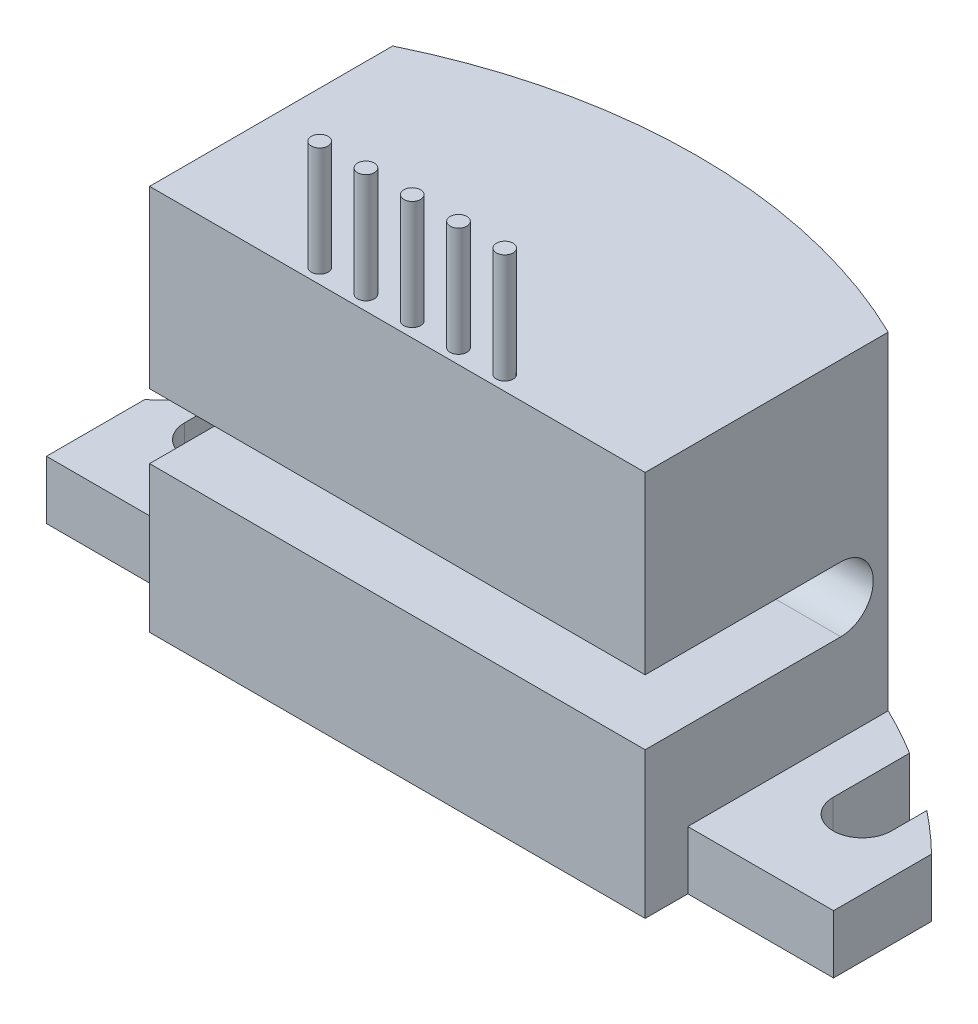
ISO-10303-21;
HEADER;
FILE_DESCRIPTION(('STEP AP214'),'2;1');
FILE_NAME('part.step','',(''),(''),'','','');
FILE_SCHEMA(('AUTOMOTIVE_DESIGN { 1 0 10303 214 1 1 1 1 }'));
ENDSEC;
DATA;
#1=APPLICATION_CONTEXT('core data for automotive mechanical design processes');
#2=APPLICATION_PROTOCOL_DEFINITION('international standard','automotive_design',2000,#1);
#3=PRODUCT_CONTEXT('',#1,'mechanical');
#4=PRODUCT('Part','Part','',(#3));
#5=PRODUCT_RELATED_PRODUCT_CATEGORY('part','',(#4));
#6=PRODUCT_DEFINITION_FORMATION('','',#4);
#7=PRODUCT_DEFINITION_CONTEXT('part definition',#1,'design');
#8=PRODUCT_DEFINITION('design','',#6,#7);
#9=PRODUCT_DEFINITION_SHAPE('','',#8);
#10=(LENGTH_UNIT() NAMED_UNIT(*) SI_UNIT(.MILLI.,.METRE.));
#11=(NAMED_UNIT(*) PLANE_ANGLE_UNIT() SI_UNIT($,.RADIAN.));
#12=(NAMED_UNIT(*) SI_UNIT($,.STERADIAN.) SOLID_ANGLE_UNIT());
#13=UNCERTAINTY_MEASURE_WITH_UNIT(LENGTH_MEASURE(1.E-05),#10,'distance_accuracy_value','');
#14=(GEOMETRIC_REPRESENTATION_CONTEXT(3) GLOBAL_UNCERTAINTY_ASSIGNED_CONTEXT((#13)) GLOBAL_UNIT_ASSIGNED_CONTEXT((#10,
#11,#12)) REPRESENTATION_CONTEXT('',''));
#15=CARTESIAN_POINT('',(0.,0.,0.));
#16=DIRECTION('',(0.,0.,1.));
#17=DIRECTION('',(1.,0.,0.));
#18=AXIS2_PLACEMENT_3D('',#15,#16,#17);
#19=CARTESIAN_POINT('',(-6.8,14.4,-7.25800341788039));
#20=DIRECTION('',(0.,0.,-1.));
#21=DIRECTION('',(-1.,0.,0.));
#22=AXIS2_PLACEMENT_3D('',#19,#20,#21);
#23=PLANE('',#22);
#24=DIRECTION('',(1.,0.,0.));
#25=VECTOR('',#24,1.);
#26=CARTESIAN_POINT('',(-6.8,11.4,-7.25800341788039));
#27=LINE('',#26,#25);
#28=CARTESIAN_POINT('',(-6.8,11.4,-7.25800341788039));
#29=VERTEX_POINT('',#28);
#30=CARTESIAN_POINT('',(6.8,11.4,-7.25800341788039));
#31=VERTEX_POINT('',#30);
#32=EDGE_CURVE('E59',#29,#31,#27,.T.);
#33=ORIENTED_EDGE('',*,*,#32,.F.);
#34=DIRECTION('',(0.,-1.,0.));
#35=VECTOR('',#34,1.);
#36=CARTESIAN_POINT('',(-6.8,14.4,-7.25800341788039));
#37=LINE('',#36,#35);
#38=CARTESIAN_POINT('',(-6.8,6.59,-7.25800341788039));
#39=VERTEX_POINT('',#38);
#40=EDGE_CURVE('E274',#29,#39,#37,.T.);
#41=ORIENTED_EDGE('',*,*,#40,.T.);
#42=DIRECTION('',(-1.,0.,0.));
#43=VECTOR('',#42,1.);
#44=CARTESIAN_POINT('',(10.8,6.59,-7.25800341788035));
#45=LINE('',#44,#43);
#46=CARTESIAN_POINT('',(6.8,6.59,-7.25800341788036));
#47=VERTEX_POINT('',#46);
#48=EDGE_CURVE('E315',#47,#39,#45,.T.);
#49=ORIENTED_EDGE('',*,*,#48,.F.);
#50=DIRECTION('',(0.,-1.,0.));
#51=VECTOR('',#50,1.);
#52=CARTESIAN_POINT('',(6.8,14.4,-7.25800341788039));
#53=LINE('',#52,#51);
#54=EDGE_CURVE('E271',#31,#47,#53,.T.);
#55=ORIENTED_EDGE('',*,*,#54,.F.);
#56=EDGE_LOOP('',(#33,#41,#49,#55));
#57=FACE_BOUND('',#56,.T.);
#58=ADVANCED_FACE('F45',(#57),#23,.F.);
#59=CARTESIAN_POINT('',(0.,14.4,0.));
#60=DIRECTION('',(0.,-1.,0.));
#61=DIRECTION('',(0.,0.,-1.));
#62=AXIS2_PLACEMENT_3D('',#59,#60,#61);
#63=CYLINDRICAL_SURFACE('',#62,15.5);
#64=CARTESIAN_POINT('',(0.,11.4,0.));
#65=DIRECTION('',(0.,1.,0.));
#66=DIRECTION('',(0.,0.,1.));
#67=AXIS2_PLACEMENT_3D('',#64,#65,#66);
#68=CIRCLE('',#67,15.5);
#69=CARTESIAN_POINT('',(6.8,11.4,-13.9287472516375));
#70=VERTEX_POINT('',#69);
#71=CARTESIAN_POINT('',(-6.8,11.4,-13.9287472516375));
#72=VERTEX_POINT('',#71);
#73=EDGE_CURVE('E192',#70,#72,#68,.T.);
#74=ORIENTED_EDGE('',*,*,#73,.F.);
#75=DIRECTION('',(0.,1.,0.));
#76=VECTOR('',#75,1.);
#77=CARTESIAN_POINT('',(6.8,2.4,-13.9287472516375));
#78=LINE('',#77,#76);
#79=CARTESIAN_POINT('',(6.8,2.4,-13.9287472516375));
#80=VERTEX_POINT('',#79);
#81=EDGE_CURVE('E202',#80,#70,#78,.T.);
#82=ORIENTED_EDGE('',*,*,#81,.F.);
#83=CARTESIAN_POINT('',(0.,2.4,0.));
#84=DIRECTION('',(0.,-1.,0.));
#85=DIRECTION('',(0.,0.,-1.));
#86=AXIS2_PLACEMENT_3D('',#83,#84,#85);
#87=CIRCLE('',#86,15.5);
#88=CARTESIAN_POINT('',(8.1,2.4,-13.2151428293454));
#89=VERTEX_POINT('',#88);
#90=EDGE_CURVE('E219',#80,#89,#87,.T.);
#91=ORIENTED_EDGE('',*,*,#90,.T.);
#92=DIRECTION('',(0.,-1.,0.));
#93=VECTOR('',#92,1.);
#94=CARTESIAN_POINT('',(8.1,14.4,-13.2151428293454));
#95=LINE('',#94,#93);
#96=CARTESIAN_POINT('',(8.1,0.8,-13.2151428293454));
#97=VERTEX_POINT('',#96);
#98=EDGE_CURVE('E342',#89,#97,#95,.T.);
#99=ORIENTED_EDGE('',*,*,#98,.T.);
#100=CARTESIAN_POINT('',(0.,0.8,0.));
#101=DIRECTION('',(0.,-1.,0.));
#102=DIRECTION('',(0.,0.,-1.));
#103=AXIS2_PLACEMENT_3D('',#100,#101,#102);
#104=CIRCLE('',#103,15.5);
#105=CARTESIAN_POINT('',(-8.1,0.8,-13.2151428293454));
#106=VERTEX_POINT('',#105);
#107=EDGE_CURVE('E263',#106,#97,#104,.T.);
#108=ORIENTED_EDGE('',*,*,#107,.F.);
#109=DIRECTION('',(0.,-1.,0.));
#110=VECTOR('',#109,1.);
#111=CARTESIAN_POINT('',(-8.1,14.4,-13.2151428293454));
#112=LINE('',#111,#110);
#113=CARTESIAN_POINT('',(-8.1,2.4,-13.2151428293454));
#114=VERTEX_POINT('',#113);
#115=EDGE_CURVE('E355',#114,#106,#112,.T.);
#116=ORIENTED_EDGE('',*,*,#115,.F.);
#117=CARTESIAN_POINT('',(0.,2.4,0.));
#118=DIRECTION('',(0.,1.,0.));
#119=DIRECTION('',(0.,0.,1.));
#120=AXIS2_PLACEMENT_3D('',#117,#118,#119);
#121=CIRCLE('',#120,15.5);
#122=CARTESIAN_POINT('',(-6.8,2.4,-13.9287472516375));
#123=VERTEX_POINT('',#122);
#124=EDGE_CURVE('E225',#123,#114,#121,.T.);
#125=ORIENTED_EDGE('',*,*,#124,.F.);
#126=DIRECTION('',(0.,1.,0.));
#127=VECTOR('',#126,1.);
#128=CARTESIAN_POINT('',(-6.8,2.4,-13.9287472516375));
#129=LINE('',#128,#127);
#130=EDGE_CURVE('E204',#123,#72,#129,.T.);
#131=ORIENTED_EDGE('',*,*,#130,.T.);
#132=EDGE_LOOP('',(#74,#82,#91,#99,#108,#116,#125,#131));
#133=FACE_BOUND('',#132,.T.);
#134=ADVANCED_FACE('F200',(#133),#63,.T.);
#135=CARTESIAN_POINT('',(-6.8,14.4,-8.42800341788039));
#136=DIRECTION('',(1.,0.,0.));
#137=DIRECTION('',(0.,0.,-1.));
#138=AXIS2_PLACEMENT_3D('',#135,#136,#137);
#139=PLANE('',#138);
#140=DIRECTION('',(0.,0.,1.));
#141=VECTOR('',#140,1.);
#142=CARTESIAN_POINT('',(-6.8,11.4,-8.42800341788039));
#143=LINE('',#142,#141);
#144=EDGE_CURVE('E709',#72,#29,#143,.T.);
#145=ORIENTED_EDGE('',*,*,#144,.F.);
#146=ORIENTED_EDGE('',*,*,#130,.F.);
#147=DIRECTION('',(0.,0.,-1.));
#148=VECTOR('',#147,1.);
#149=CARTESIAN_POINT('',(-6.8,2.4,-8.42800341788039));
#150=LINE('',#149,#148);
#151=CARTESIAN_POINT('',(-6.8,2.4,-8.42800341788039));
#152=VERTEX_POINT('',#151);
#153=EDGE_CURVE('E213',#152,#123,#150,.T.);
#154=ORIENTED_EDGE('',*,*,#153,.F.);
#155=DIRECTION('',(0.,-1.,0.));
#156=VECTOR('',#155,1.);
#157=CARTESIAN_POINT('',(-6.8,14.4,-8.42800341788039));
#158=LINE('',#157,#156);
#159=CARTESIAN_POINT('',(-6.8,0.8,-8.42800341788039));
#160=VERTEX_POINT('',#159);
#161=EDGE_CURVE('E276',#152,#160,#158,.T.);
#162=ORIENTED_EDGE('',*,*,#161,.T.);
#163=DIRECTION('',(0.,0.,-1.));
#164=VECTOR('',#163,1.);
#165=CARTESIAN_POINT('',(-6.8,0.8,-8.42800341788039));
#166=LINE('',#165,#164);
#167=CARTESIAN_POINT('',(-6.8,0.8,-7.25800341788039));
#168=VERTEX_POINT('',#167);
#169=EDGE_CURVE('E249',#168,#160,#166,.T.);
#170=ORIENTED_EDGE('',*,*,#169,.F.);
#171=CARTESIAN_POINT('',(-6.8,4.81,-7.25800341788039));
#172=VERTEX_POINT('',#171);
#173=EDGE_CURVE('E273',#172,#168,#37,.T.);
#174=ORIENTED_EDGE('',*,*,#173,.F.);
#175=DIRECTION('',(0.,0.,1.));
#176=VECTOR('',#175,1.);
#177=CARTESIAN_POINT('',(-6.8,4.81,-7.25800341788039));
#178=LINE('',#177,#176);
#179=CARTESIAN_POINT('',(-6.79999999999999,4.81,-12.6280034178804));
#180=VERTEX_POINT('',#179);
#181=EDGE_CURVE('E714',#180,#172,#178,.T.);
#182=ORIENTED_EDGE('',*,*,#181,.F.);
#183=CARTESIAN_POINT('',(-6.79999999999999,5.7,-12.6280034178804));
#184=DIRECTION('',(-1.,0.,0.));
#185=DIRECTION('',(0.,0.,1.));
#186=AXIS2_PLACEMENT_3D('',#183,#184,#185);
#187=CIRCLE('',#186,0.89);
#188=CARTESIAN_POINT('',(-6.79999999999999,6.59,-12.6280034178804));
#189=VERTEX_POINT('',#188);
#190=EDGE_CURVE('E711',#189,#180,#187,.T.);
#191=ORIENTED_EDGE('',*,*,#190,.F.);
#192=DIRECTION('',(0.,0.,-1.));
#193=VECTOR('',#192,1.);
#194=CARTESIAN_POINT('',(-6.79999999999999,6.59,-12.6280034178804));
#195=LINE('',#194,#193);
#196=EDGE_CURVE('E328',#39,#189,#195,.T.);
#197=ORIENTED_EDGE('',*,*,#196,.F.);
#198=ORIENTED_EDGE('',*,*,#40,.F.);
#199=EDGE_LOOP('',(#145,#146,#154,#162,#170,#174,#182,#191,#197,#198));
#200=FACE_BOUND('',#199,.T.);
#201=ADVANCED_FACE('F391',(#200),#139,.F.);
#202=CARTESIAN_POINT('',(6.8,14.4,-7.25800341788039));
#203=DIRECTION('',(-1.,0.,0.));
#204=DIRECTION('',(0.,0.,1.));
#205=AXIS2_PLACEMENT_3D('',#202,#203,#204);
#206=PLANE('',#205);
#207=DIRECTION('',(0.,0.,-1.));
#208=VECTOR('',#207,1.);
#209=CARTESIAN_POINT('',(6.8,11.4,-7.25800341788039));
#210=LINE('',#209,#208);
#211=EDGE_CURVE('E12',#31,#70,#210,.T.);
#212=ORIENTED_EDGE('',*,*,#211,.F.);
#213=ORIENTED_EDGE('',*,*,#54,.T.);
#214=DIRECTION('',(0.,0.,-1.));
#215=VECTOR('',#214,1.);
#216=CARTESIAN_POINT('',(6.8,6.59,-7.25800341788039));
#217=LINE('',#216,#215);
#218=CARTESIAN_POINT('',(6.8,6.59,-12.6280034178804));
#219=VERTEX_POINT('',#218);
#220=EDGE_CURVE('E53',#47,#219,#217,.T.);
#221=ORIENTED_EDGE('',*,*,#220,.T.);
#222=CARTESIAN_POINT('',(6.8,5.7,-12.6280034178804));
#223=DIRECTION('',(-1.,0.,0.));
#224=DIRECTION('',(0.,0.,1.));
#225=AXIS2_PLACEMENT_3D('',#222,#223,#224);
#226=CIRCLE('',#225,0.89);
#227=CARTESIAN_POINT('',(6.8,4.81,-12.6280034178804));
#228=VERTEX_POINT('',#227);
#229=EDGE_CURVE('E305',#219,#228,#226,.T.);
#230=ORIENTED_EDGE('',*,*,#229,.T.);
#231=DIRECTION('',(0.,0.,1.));
#232=VECTOR('',#231,1.);
#233=CARTESIAN_POINT('',(6.8,4.81,-7.25800341788038));
#234=LINE('',#233,#232);
#235=CARTESIAN_POINT('',(6.8,4.81,-7.25800341788039));
#236=VERTEX_POINT('',#235);
#237=EDGE_CURVE('E303',#228,#236,#234,.T.);
#238=ORIENTED_EDGE('',*,*,#237,.T.);
#239=CARTESIAN_POINT('',(6.8,0.8,-7.25800341788039));
#240=VERTEX_POINT('',#239);
#241=EDGE_CURVE('E270',#236,#240,#53,.T.);
#242=ORIENTED_EDGE('',*,*,#241,.T.);
#243=DIRECTION('',(0.,0.,1.));
#244=VECTOR('',#243,1.);
#245=CARTESIAN_POINT('',(6.8,0.8,-7.25800341788039));
#246=LINE('',#245,#244);
#247=CARTESIAN_POINT('',(6.8,0.8,-8.42800341788039));
#248=VERTEX_POINT('',#247);
#249=EDGE_CURVE('E243',#248,#240,#246,.T.);
#250=ORIENTED_EDGE('',*,*,#249,.F.);
#251=DIRECTION('',(0.,-1.,0.));
#252=VECTOR('',#251,1.);
#253=CARTESIAN_POINT('',(6.8,14.4,-8.42800341788039));
#254=LINE('',#253,#252);
#255=CARTESIAN_POINT('',(6.8,2.4,-8.42800341788039));
#256=VERTEX_POINT('',#255);
#257=EDGE_CURVE('E268',#256,#248,#254,.T.);
#258=ORIENTED_EDGE('',*,*,#257,.F.);
#259=DIRECTION('',(0.,0.,1.));
#260=VECTOR('',#259,1.);
#261=CARTESIAN_POINT('',(6.8,2.4,-8.42800341788039));
#262=LINE('',#261,#260);
#263=EDGE_CURVE('E210',#80,#256,#262,.T.);
#264=ORIENTED_EDGE('',*,*,#263,.F.);
#265=ORIENTED_EDGE('',*,*,#81,.T.);
#266=EDGE_LOOP('',(#212,#213,#221,#230,#238,#242,#250,#258,#264,#265));
#267=FACE_BOUND('',#266,.T.);
#268=ADVANCED_FACE('F208',(#267),#206,.F.);
#269=CARTESIAN_POINT('',(9.7,0.8,-12.0896650077659));
#270=VERTEX_POINT('',#269);
#271=CARTESIAN_POINT('',(10.8,0.8,-11.1180034178804));
#272=VERTEX_POINT('',#271);
#273=EDGE_CURVE('E258',#270,#272,#104,.T.);
#274=ORIENTED_EDGE('',*,*,#273,.F.);
#275=DIRECTION('',(0.,-1.,0.));
#276=VECTOR('',#275,1.);
#277=CARTESIAN_POINT('',(9.7,14.4,-12.0896650077659));
#278=LINE('',#277,#276);
#279=CARTESIAN_POINT('',(9.7,2.4,-12.0896650077659));
#280=VERTEX_POINT('',#279);
#281=EDGE_CURVE('E360',#270,#280,#278,.F.);
#282=ORIENTED_EDGE('',*,*,#281,.T.);
#283=CARTESIAN_POINT('',(10.8,2.4,-11.1180034178804));
#284=VERTEX_POINT('',#283);
#285=EDGE_CURVE('E222',#280,#284,#87,.T.);
#286=ORIENTED_EDGE('',*,*,#285,.T.);
#287=DIRECTION('',(0.,-1.,0.));
#288=VECTOR('',#287,1.);
#289=CARTESIAN_POINT('',(10.8,14.4,-11.1180034178804));
#290=LINE('',#289,#288);
#291=EDGE_CURVE('E262',#284,#272,#290,.T.);
#292=ORIENTED_EDGE('',*,*,#291,.T.);
#293=EDGE_LOOP('',(#274,#282,#286,#292));
#294=FACE_BOUND('',#293,.T.);
#295=ADVANCED_FACE('F428',(#294),#63,.T.);
#296=CARTESIAN_POINT('',(-10.8,14.4,-11.1180034178804));
#297=DIRECTION('',(1.,0.,0.));
#298=DIRECTION('',(0.,0.,-1.));
#299=AXIS2_PLACEMENT_3D('',#296,#297,#298);
#300=PLANE('',#299);
#301=DIRECTION('',(0.,0.,1.));
#302=VECTOR('',#301,1.);
#303=CARTESIAN_POINT('',(-10.8,2.4,-11.1180034178804));
#304=LINE('',#303,#302);
#305=CARTESIAN_POINT('',(-10.8,2.4,-11.1180034178804));
#306=VERTEX_POINT('',#305);
#307=CARTESIAN_POINT('',(-10.8,2.4,-8.42800341788039));
#308=VERTEX_POINT('',#307);
#309=EDGE_CURVE('E221',#306,#308,#304,.T.);
#310=ORIENTED_EDGE('',*,*,#309,.F.);
#311=DIRECTION('',(0.,-1.,0.));
#312=VECTOR('',#311,1.);
#313=CARTESIAN_POINT('',(-10.8,14.4,-11.1180034178804));
#314=LINE('',#313,#312);
#315=CARTESIAN_POINT('',(-10.8,0.8,-11.1180034178804));
#316=VERTEX_POINT('',#315);
#317=EDGE_CURVE('E280',#306,#316,#314,.T.);
#318=ORIENTED_EDGE('',*,*,#317,.T.);
#319=DIRECTION('',(0.,0.,-1.));
#320=VECTOR('',#319,1.);
#321=CARTESIAN_POINT('',(-10.8,0.8,-11.1180034178804));
#322=LINE('',#321,#320);
#323=CARTESIAN_POINT('',(-10.8,0.8,-8.42800341788039));
#324=VERTEX_POINT('',#323);
#325=EDGE_CURVE('E255',#324,#316,#322,.T.);
#326=ORIENTED_EDGE('',*,*,#325,.F.);
#327=DIRECTION('',(0.,-1.,0.));
#328=VECTOR('',#327,1.);
#329=CARTESIAN_POINT('',(-10.8,14.4,-8.42800341788039));
#330=LINE('',#329,#328);
#331=EDGE_CURVE('E278',#308,#324,#330,.T.);
#332=ORIENTED_EDGE('',*,*,#331,.F.);
#333=EDGE_LOOP('',(#310,#318,#326,#332));
#334=FACE_BOUND('',#333,.T.);
#335=ADVANCED_FACE('F403',(#334),#300,.F.);
#336=CARTESIAN_POINT('',(-10.8,14.4,-8.42800341788039));
#337=DIRECTION('',(0.,0.,-1.));
#338=DIRECTION('',(-1.,0.,0.));
#339=AXIS2_PLACEMENT_3D('',#336,#337,#338);
#340=PLANE('',#339);
#341=DIRECTION('',(1.,0.,0.));
#342=VECTOR('',#341,1.);
#343=CARTESIAN_POINT('',(-13.3426310951634,2.4,-8.42800341788039));
#344=LINE('',#343,#342);
#345=EDGE_CURVE('E211',#308,#152,#344,.T.);
#346=ORIENTED_EDGE('',*,*,#345,.F.);
#347=ORIENTED_EDGE('',*,*,#331,.T.);
#348=DIRECTION('',(-1.,0.,0.));
#349=VECTOR('',#348,1.);
#350=CARTESIAN_POINT('',(-10.8,0.8,-8.42800341788039));
#351=LINE('',#350,#349);
#352=EDGE_CURVE('E252',#160,#324,#351,.T.);
#353=ORIENTED_EDGE('',*,*,#352,.F.);
#354=ORIENTED_EDGE('',*,*,#161,.F.);
#355=EDGE_LOOP('',(#346,#347,#353,#354));
#356=FACE_BOUND('',#355,.T.);
#357=ADVANCED_FACE('F397',(#356),#340,.F.);
#358=CARTESIAN_POINT('',(-9.7,2.4,-12.0896650077659));
#359=VERTEX_POINT('',#358);
#360=EDGE_CURVE('E224',#359,#306,#121,.T.);
#361=ORIENTED_EDGE('',*,*,#360,.F.);
#362=DIRECTION('',(0.,-1.,0.));
#363=VECTOR('',#362,1.);
#364=CARTESIAN_POINT('',(-9.7,14.4,-12.0896650077659));
#365=LINE('',#364,#363);
#366=CARTESIAN_POINT('',(-9.7,0.8,-12.0896650077659));
#367=VERTEX_POINT('',#366);
#368=EDGE_CURVE('E341',#359,#367,#365,.T.);
#369=ORIENTED_EDGE('',*,*,#368,.T.);
#370=EDGE_CURVE('E259',#316,#367,#104,.T.);
#371=ORIENTED_EDGE('',*,*,#370,.F.);
#372=ORIENTED_EDGE('',*,*,#317,.F.);
#373=EDGE_LOOP('',(#361,#369,#371,#372));
#374=FACE_BOUND('',#373,.T.);
#375=ADVANCED_FACE('F47',(#374),#63,.T.);
#376=ORIENTED_EDGE('',*,*,#241,.F.);
#377=DIRECTION('',(-1.,0.,0.));
#378=VECTOR('',#377,1.);
#379=CARTESIAN_POINT('',(10.8,4.81,-7.25800341788035));
#380=LINE('',#379,#378);
#381=EDGE_CURVE('E67',#236,#172,#380,.T.);
#382=ORIENTED_EDGE('',*,*,#381,.T.);
#383=ORIENTED_EDGE('',*,*,#173,.T.);
#384=DIRECTION('',(-1.,0.,0.));
#385=VECTOR('',#384,1.);
#386=CARTESIAN_POINT('',(-6.8,0.8,-7.25800341788039));
#387=LINE('',#386,#385);
#388=EDGE_CURVE('E246',#240,#168,#387,.T.);
#389=ORIENTED_EDGE('',*,*,#388,.F.);
#390=EDGE_LOOP('',(#376,#382,#383,#389));
#391=FACE_BOUND('',#390,.T.);
#392=ADVANCED_FACE('F386',(#391),#23,.F.);
#393=CARTESIAN_POINT('',(6.8,14.4,-8.42800341788039));
#394=DIRECTION('',(0.,0.,-1.));
#395=DIRECTION('',(-1.,0.,0.));
#396=AXIS2_PLACEMENT_3D('',#393,#394,#395);
#397=PLANE('',#396);
#398=DIRECTION('',(0.,-1.,0.));
#399=VECTOR('',#398,1.);
#400=CARTESIAN_POINT('',(10.8,14.4,-8.42800341788039));
#401=LINE('',#400,#399);
#402=CARTESIAN_POINT('',(10.8,2.4,-8.42800341788039));
#403=VERTEX_POINT('',#402);
#404=CARTESIAN_POINT('',(10.8,0.8,-8.42800341788039));
#405=VERTEX_POINT('',#404);
#406=EDGE_CURVE('E266',#403,#405,#401,.T.);
#407=ORIENTED_EDGE('',*,*,#406,.F.);
#408=DIRECTION('',(1.,0.,0.));
#409=VECTOR('',#408,1.);
#410=CARTESIAN_POINT('',(12.641537105285,2.4,-8.42800341788039));
#411=LINE('',#410,#409);
#412=EDGE_CURVE('E215',#256,#403,#411,.T.);
#413=ORIENTED_EDGE('',*,*,#412,.F.);
#414=ORIENTED_EDGE('',*,*,#257,.T.);
#415=DIRECTION('',(-1.,0.,0.));
#416=VECTOR('',#415,1.);
#417=CARTESIAN_POINT('',(6.8,0.8,-8.42800341788039));
#418=LINE('',#417,#416);
#419=EDGE_CURVE('E238',#405,#248,#418,.T.);
#420=ORIENTED_EDGE('',*,*,#419,.F.);
#421=EDGE_LOOP('',(#407,#413,#414,#420));
#422=FACE_BOUND('',#421,.T.);
#423=ADVANCED_FACE('F377',(#422),#397,.F.);
#424=CARTESIAN_POINT('',(10.8,14.4,-8.42800341788039));
#425=DIRECTION('',(-1.,0.,0.));
#426=DIRECTION('',(0.,0.,1.));
#427=AXIS2_PLACEMENT_3D('',#424,#425,#426);
#428=PLANE('',#427);
#429=ORIENTED_EDGE('',*,*,#291,.F.);
#430=DIRECTION('',(0.,0.,1.));
#431=VECTOR('',#430,1.);
#432=CARTESIAN_POINT('',(10.8,2.4,-8.42800341788039));
#433=LINE('',#432,#431);
#434=EDGE_CURVE('E285',#284,#403,#433,.T.);
#435=ORIENTED_EDGE('',*,*,#434,.T.);
#436=ORIENTED_EDGE('',*,*,#406,.T.);
#437=DIRECTION('',(0.,0.,1.));
#438=VECTOR('',#437,1.);
#439=CARTESIAN_POINT('',(10.8,0.8,-8.42800341788039));
#440=LINE('',#439,#438);
#441=EDGE_CURVE('E282',#272,#405,#440,.T.);
#442=ORIENTED_EDGE('',*,*,#441,.F.);
#443=EDGE_LOOP('',(#429,#435,#436,#442));
#444=FACE_BOUND('',#443,.T.);
#445=ADVANCED_FACE('F374',(#444),#428,.F.);
#446=CARTESIAN_POINT('',(0.,0.8,-10.9480034178804));
#447=DIRECTION('',(0.,-1.,0.));
#448=DIRECTION('',(0.,0.,-1.));
#449=AXIS2_PLACEMENT_3D('',#446,#447,#448);
#450=PLANE('',#449);
#451=DIRECTION('',(0.,0.,1.));
#452=VECTOR('',#451,1.);
#453=CARTESIAN_POINT('',(9.7,0.8,-11.1180034178804));
#454=LINE('',#453,#452);
#455=CARTESIAN_POINT('',(9.7,0.8,-11.1180034178804));
#456=VERTEX_POINT('',#455);
#457=EDGE_CURVE('E335',#270,#456,#454,.T.);
#458=ORIENTED_EDGE('',*,*,#457,.F.);
#459=ORIENTED_EDGE('',*,*,#273,.T.);
#460=ORIENTED_EDGE('',*,*,#441,.T.);
#461=ORIENTED_EDGE('',*,*,#419,.T.);
#462=ORIENTED_EDGE('',*,*,#249,.T.);
#463=ORIENTED_EDGE('',*,*,#388,.T.);
#464=ORIENTED_EDGE('',*,*,#169,.T.);
#465=ORIENTED_EDGE('',*,*,#352,.T.);
#466=ORIENTED_EDGE('',*,*,#325,.T.);
#467=ORIENTED_EDGE('',*,*,#370,.T.);
#468=DIRECTION('',(0.,0.,-1.));
#469=VECTOR('',#468,1.);
#470=CARTESIAN_POINT('',(-9.7,0.8,-13.2151428293454));
#471=LINE('',#470,#469);
#472=CARTESIAN_POINT('',(-9.7,0.8,-11.1180034178804));
#473=VERTEX_POINT('',#472);
#474=EDGE_CURVE('E348',#473,#367,#471,.T.);
#475=ORIENTED_EDGE('',*,*,#474,.F.);
#476=CARTESIAN_POINT('',(-8.9,0.8,-11.1180034178804));
#477=DIRECTION('',(0.,-1.,0.));
#478=DIRECTION('',(0.,0.,-1.));
#479=AXIS2_PLACEMENT_3D('',#476,#477,#478);
#480=CIRCLE('',#479,0.8);
#481=CARTESIAN_POINT('',(-8.1,0.8,-11.1180034178804));
#482=VERTEX_POINT('',#481);
#483=EDGE_CURVE('E321',#482,#473,#480,.T.);
#484=ORIENTED_EDGE('',*,*,#483,.F.);
#485=DIRECTION('',(0.,0.,1.));
#486=VECTOR('',#485,1.);
#487=CARTESIAN_POINT('',(-8.1,0.8,-11.1180034178804));
#488=LINE('',#487,#486);
#489=EDGE_CURVE('E350',#106,#482,#488,.T.);
#490=ORIENTED_EDGE('',*,*,#489,.F.);
#491=ORIENTED_EDGE('',*,*,#107,.T.);
#492=DIRECTION('',(0.,0.,-1.));
#493=VECTOR('',#492,1.);
#494=CARTESIAN_POINT('',(8.1,0.8,-11.1180034178804));
#495=LINE('',#494,#493);
#496=CARTESIAN_POINT('',(8.1,0.8,-11.1180034178804));
#497=VERTEX_POINT('',#496);
#498=EDGE_CURVE('E332',#497,#97,#495,.T.);
#499=ORIENTED_EDGE('',*,*,#498,.F.);
#500=CARTESIAN_POINT('',(8.9,0.8,-11.1180034178804));
#501=DIRECTION('',(0.,-1.,0.));
#502=DIRECTION('',(0.,0.,-1.));
#503=AXIS2_PLACEMENT_3D('',#500,#501,#502);
#504=CIRCLE('',#503,0.8);
#505=EDGE_CURVE('E329',#456,#497,#504,.T.);
#506=ORIENTED_EDGE('',*,*,#505,.F.);
#507=EDGE_LOOP('',(#458,#459,#460,#461,#462,#463,#464,#465,#466,#467,#475,#484,#490,#491,#499,#506));
#508=FACE_BOUND('',#507,.T.);
#509=CARTESIAN_POINT('',(6.4,0.8,-10.9480034178804));
#510=DIRECTION('',(0.,-1.,0.));
#511=DIRECTION('',(0.,0.,-1.));
#512=AXIS2_PLACEMENT_3D('',#509,#510,#511);
#513=CIRCLE('',#512,1.);
#514=CARTESIAN_POINT('',(6.4,0.8,-11.9480034178804));
#515=VERTEX_POINT('',#514);
#516=EDGE_CURVE('E235',#515,#515,#513,.T.);
#517=ORIENTED_EDGE('',*,*,#516,.F.);
#518=EDGE_LOOP('',(#517));
#519=FACE_BOUND('',#518,.T.);
#520=CARTESIAN_POINT('',(-6.4,0.8,-10.9480034178804));
#521=DIRECTION('',(0.,-1.,0.));
#522=DIRECTION('',(0.,0.,-1.));
#523=AXIS2_PLACEMENT_3D('',#520,#521,#522);
#524=CIRCLE('',#523,1.);
#525=CARTESIAN_POINT('',(-6.4,0.8,-11.9480034178804));
#526=VERTEX_POINT('',#525);
#527=EDGE_CURVE('E229',#526,#526,#524,.T.);
#528=ORIENTED_EDGE('',*,*,#527,.F.);
#529=EDGE_LOOP('',(#528));
#530=FACE_BOUND('',#529,.T.);
#531=ADVANCED_FACE('F381',(#508,#519,#530),#450,.T.);
#532=CARTESIAN_POINT('',(6.4,0.8,-10.9480034178804));
#533=DIRECTION('',(0.,-1.,0.));
#534=DIRECTION('',(0.,0.,-1.));
#535=AXIS2_PLACEMENT_3D('',#532,#533,#534);
#536=CYLINDRICAL_SURFACE('',#535,1.);
#537=ORIENTED_EDGE('',*,*,#516,.T.);
#538=EDGE_LOOP('',(#537));
#539=FACE_BOUND('',#538,.T.);
#540=CARTESIAN_POINT('',(6.4,0.,-10.9480034178804));
#541=DIRECTION('',(0.,-1.,0.));
#542=DIRECTION('',(0.,0.,-1.));
#543=AXIS2_PLACEMENT_3D('',#540,#541,#542);
#544=CIRCLE('',#543,1.);
#545=CARTESIAN_POINT('',(6.4,0.,-11.9480034178804));
#546=VERTEX_POINT('',#545);
#547=EDGE_CURVE('E232',#546,#546,#544,.T.);
#548=ORIENTED_EDGE('',*,*,#547,.F.);
#549=EDGE_LOOP('',(#548));
#550=FACE_BOUND('',#549,.T.);
#551=ADVANCED_FACE('F490',(#539,#550),#536,.T.);
#552=CARTESIAN_POINT('',(-6.4,0.8,-10.9480034178804));
#553=DIRECTION('',(0.,-1.,0.));
#554=DIRECTION('',(0.,0.,-1.));
#555=AXIS2_PLACEMENT_3D('',#552,#553,#554);
#556=CYLINDRICAL_SURFACE('',#555,1.);
#557=ORIENTED_EDGE('',*,*,#527,.T.);
#558=EDGE_LOOP('',(#557));
#559=FACE_BOUND('',#558,.T.);
#560=CARTESIAN_POINT('',(-6.4,0.,-10.9480034178804));
#561=DIRECTION('',(0.,-1.,0.));
#562=DIRECTION('',(0.,0.,-1.));
#563=AXIS2_PLACEMENT_3D('',#560,#561,#562);
#564=CIRCLE('',#563,1.);
#565=CARTESIAN_POINT('',(-6.4,0.,-11.9480034178804));
#566=VERTEX_POINT('',#565);
#567=EDGE_CURVE('E228',#566,#566,#564,.T.);
#568=ORIENTED_EDGE('',*,*,#567,.F.);
#569=EDGE_LOOP('',(#568));
#570=FACE_BOUND('',#569,.T.);
#571=ADVANCED_FACE('F480',(#559,#570),#556,.T.);
#572=CARTESIAN_POINT('',(0.,0.,0.));
#573=DIRECTION('',(0.,1.,0.));
#574=DIRECTION('',(0.,0.,1.));
#575=AXIS2_PLACEMENT_3D('',#572,#573,#574);
#576=PLANE('',#575);
#577=ORIENTED_EDGE('',*,*,#547,.T.);
#578=EDGE_LOOP('',(#577));
#579=FACE_BOUND('',#578,.T.);
#580=ADVANCED_FACE('F476',(#579),#576,.F.);
#581=ORIENTED_EDGE('',*,*,#567,.T.);
#582=EDGE_LOOP('',(#581));
#583=FACE_BOUND('',#582,.T.);
#584=ADVANCED_FACE('F479',(#583),#576,.F.);
#585=CARTESIAN_POINT('',(0.,2.4,0.));
#586=DIRECTION('',(0.,-1.,0.));
#587=DIRECTION('',(0.,0.,-1.));
#588=AXIS2_PLACEMENT_3D('',#585,#586,#587);
#589=PLANE('',#588);
#590=ORIENTED_EDGE('',*,*,#285,.F.);
#591=DIRECTION('',(0.,0.,1.));
#592=VECTOR('',#591,1.);
#593=CARTESIAN_POINT('',(9.7,2.4,0.));
#594=LINE('',#593,#592);
#595=CARTESIAN_POINT('',(9.7,2.4,-11.1180034178804));
#596=VERTEX_POINT('',#595);
#597=EDGE_CURVE('E300',#280,#596,#594,.T.);
#598=ORIENTED_EDGE('',*,*,#597,.T.);
#599=CARTESIAN_POINT('',(8.9,2.4,-11.1180034178804));
#600=DIRECTION('',(0.,-1.,0.));
#601=DIRECTION('',(0.,0.,-1.));
#602=AXIS2_PLACEMENT_3D('',#599,#600,#601);
#603=CIRCLE('',#602,0.8);
#604=CARTESIAN_POINT('',(8.1,2.4,-11.1180034178804));
#605=VERTEX_POINT('',#604);
#606=EDGE_CURVE('E297',#596,#605,#603,.T.);
#607=ORIENTED_EDGE('',*,*,#606,.T.);
#608=DIRECTION('',(0.,0.,-1.));
#609=VECTOR('',#608,1.);
#610=CARTESIAN_POINT('',(8.1,2.4,0.));
#611=LINE('',#610,#609);
#612=EDGE_CURVE('E294',#605,#89,#611,.T.);
#613=ORIENTED_EDGE('',*,*,#612,.T.);
#614=ORIENTED_EDGE('',*,*,#90,.F.);
#615=ORIENTED_EDGE('',*,*,#263,.T.);
#616=ORIENTED_EDGE('',*,*,#412,.T.);
#617=ORIENTED_EDGE('',*,*,#434,.F.);
#618=EDGE_LOOP('',(#590,#598,#607,#613,#614,#615,#616,#617));
#619=FACE_BOUND('',#618,.T.);
#620=ADVANCED_FACE('F369',(#619),#589,.F.);
#621=CARTESIAN_POINT('',(0.,2.4,0.));
#622=DIRECTION('',(0.,1.,0.));
#623=DIRECTION('',(0.,0.,1.));
#624=AXIS2_PLACEMENT_3D('',#621,#622,#623);
#625=PLANE('',#624);
#626=DIRECTION('',(0.,0.,-1.));
#627=VECTOR('',#626,1.);
#628=CARTESIAN_POINT('',(-8.1,2.4,0.));
#629=LINE('',#628,#627);
#630=CARTESIAN_POINT('',(-8.1,2.4,-11.1180034178804));
#631=VERTEX_POINT('',#630);
#632=EDGE_CURVE('E292',#631,#114,#629,.T.);
#633=ORIENTED_EDGE('',*,*,#632,.F.);
#634=CARTESIAN_POINT('',(-8.9,2.4,-11.1180034178804));
#635=DIRECTION('',(0.,1.,0.));
#636=DIRECTION('',(0.,0.,1.));
#637=AXIS2_PLACEMENT_3D('',#634,#635,#636);
#638=CIRCLE('',#637,0.8);
#639=CARTESIAN_POINT('',(-9.7,2.4,-11.1180034178804));
#640=VERTEX_POINT('',#639);
#641=EDGE_CURVE('E290',#640,#631,#638,.T.);
#642=ORIENTED_EDGE('',*,*,#641,.F.);
#643=DIRECTION('',(0.,0.,1.));
#644=VECTOR('',#643,1.);
#645=CARTESIAN_POINT('',(-9.7,2.4,0.));
#646=LINE('',#645,#644);
#647=EDGE_CURVE('E288',#359,#640,#646,.T.);
#648=ORIENTED_EDGE('',*,*,#647,.F.);
#649=ORIENTED_EDGE('',*,*,#360,.T.);
#650=ORIENTED_EDGE('',*,*,#309,.T.);
#651=ORIENTED_EDGE('',*,*,#345,.T.);
#652=ORIENTED_EDGE('',*,*,#153,.T.);
#653=ORIENTED_EDGE('',*,*,#124,.T.);
#654=EDGE_LOOP('',(#633,#642,#648,#649,#650,#651,#652,#653));
#655=FACE_BOUND('',#654,.T.);
#656=ADVANCED_FACE('F499',(#655),#625,.T.);
#657=CARTESIAN_POINT('',(-9.7,14.4,-13.2151428293454));
#658=DIRECTION('',(-1.,0.,0.));
#659=DIRECTION('',(0.,0.,1.));
#660=AXIS2_PLACEMENT_3D('',#657,#658,#659);
#661=PLANE('',#660);
#662=ORIENTED_EDGE('',*,*,#647,.T.);
#663=DIRECTION('',(0.,-1.,0.));
#664=VECTOR('',#663,1.);
#665=CARTESIAN_POINT('',(-9.7,14.4,-11.1180034178804));
#666=LINE('',#665,#664);
#667=EDGE_CURVE('E353',#640,#473,#666,.T.);
#668=ORIENTED_EDGE('',*,*,#667,.T.);
#669=ORIENTED_EDGE('',*,*,#474,.T.);
#670=ORIENTED_EDGE('',*,*,#368,.F.);
#671=EDGE_LOOP('',(#662,#668,#669,#670));
#672=FACE_BOUND('',#671,.T.);
#673=ADVANCED_FACE('F411',(#672),#661,.F.);
#674=CARTESIAN_POINT('',(-8.9,14.4,-11.1180034178804));
#675=DIRECTION('',(0.,-1.,0.));
#676=DIRECTION('',(0.,0.,-1.));
#677=AXIS2_PLACEMENT_3D('',#674,#675,#676);
#678=CYLINDRICAL_SURFACE('',#677,0.8);
#679=ORIENTED_EDGE('',*,*,#641,.T.);
#680=DIRECTION('',(0.,-1.,0.));
#681=VECTOR('',#680,1.);
#682=CARTESIAN_POINT('',(-8.1,14.4,-11.1180034178804));
#683=LINE('',#682,#681);
#684=EDGE_CURVE('E333',#631,#482,#683,.T.);
#685=ORIENTED_EDGE('',*,*,#684,.T.);
#686=ORIENTED_EDGE('',*,*,#483,.T.);
#687=ORIENTED_EDGE('',*,*,#667,.F.);
#688=EDGE_LOOP('',(#679,#685,#686,#687));
#689=FACE_BOUND('',#688,.T.);
#690=ADVANCED_FACE('F416',(#689),#678,.F.);
#691=CARTESIAN_POINT('',(-8.1,14.4,-11.1180034178804));
#692=DIRECTION('',(1.,0.,0.));
#693=DIRECTION('',(0.,0.,-1.));
#694=AXIS2_PLACEMENT_3D('',#691,#692,#693);
#695=PLANE('',#694);
#696=ORIENTED_EDGE('',*,*,#632,.T.);
#697=ORIENTED_EDGE('',*,*,#115,.T.);
#698=ORIENTED_EDGE('',*,*,#489,.T.);
#699=ORIENTED_EDGE('',*,*,#684,.F.);
#700=EDGE_LOOP('',(#696,#697,#698,#699));
#701=FACE_BOUND('',#700,.T.);
#702=ADVANCED_FACE('F420',(#701),#695,.F.);
#703=CARTESIAN_POINT('',(8.9,14.4,-11.1180034178804));
#704=DIRECTION('',(0.,-1.,0.));
#705=DIRECTION('',(0.,0.,-1.));
#706=AXIS2_PLACEMENT_3D('',#703,#704,#705);
#707=CYLINDRICAL_SURFACE('',#706,0.8);
#708=DIRECTION('',(0.,-1.,0.));
#709=VECTOR('',#708,1.);
#710=CARTESIAN_POINT('',(9.7,14.4,-11.1180034178804));
#711=LINE('',#710,#709);
#712=EDGE_CURVE('E339',#596,#456,#711,.T.);
#713=ORIENTED_EDGE('',*,*,#712,.T.);
#714=ORIENTED_EDGE('',*,*,#505,.T.);
#715=DIRECTION('',(0.,-1.,0.));
#716=VECTOR('',#715,1.);
#717=CARTESIAN_POINT('',(8.1,14.4,-11.1180034178804));
#718=LINE('',#717,#716);
#719=EDGE_CURVE('E338',#605,#497,#718,.T.);
#720=ORIENTED_EDGE('',*,*,#719,.F.);
#721=ORIENTED_EDGE('',*,*,#606,.F.);
#722=EDGE_LOOP('',(#713,#714,#720,#721));
#723=FACE_BOUND('',#722,.T.);
#724=ADVANCED_FACE('F433',(#723),#707,.F.);
#725=CARTESIAN_POINT('',(9.7,14.4,-11.1180034178804));
#726=DIRECTION('',(1.,0.,0.));
#727=DIRECTION('',(0.,0.,-1.));
#728=AXIS2_PLACEMENT_3D('',#725,#726,#727);
#729=PLANE('',#728);
#730=ORIENTED_EDGE('',*,*,#457,.T.);
#731=ORIENTED_EDGE('',*,*,#712,.F.);
#732=ORIENTED_EDGE('',*,*,#597,.F.);
#733=ORIENTED_EDGE('',*,*,#281,.F.);
#734=EDGE_LOOP('',(#730,#731,#732,#733));
#735=FACE_BOUND('',#734,.T.);
#736=ADVANCED_FACE('F431',(#735),#729,.F.);
#737=CARTESIAN_POINT('',(8.1,14.4,-11.1180034178804));
#738=DIRECTION('',(-1.,0.,0.));
#739=DIRECTION('',(0.,0.,1.));
#740=AXIS2_PLACEMENT_3D('',#737,#738,#739);
#741=PLANE('',#740);
#742=ORIENTED_EDGE('',*,*,#719,.T.);
#743=ORIENTED_EDGE('',*,*,#498,.T.);
#744=ORIENTED_EDGE('',*,*,#98,.F.);
#745=ORIENTED_EDGE('',*,*,#612,.F.);
#746=EDGE_LOOP('',(#742,#743,#744,#745));
#747=FACE_BOUND('',#746,.T.);
#748=ADVANCED_FACE('F436',(#747),#741,.F.);
#749=CARTESIAN_POINT('',(10.8,5.7,-12.6280034178803));
#750=DIRECTION('',(-1.,0.,0.));
#751=DIRECTION('',(0.,0.,1.));
#752=AXIS2_PLACEMENT_3D('',#749,#750,#751);
#753=CYLINDRICAL_SURFACE('',#752,0.89);
#754=DIRECTION('',(-1.,0.,0.));
#755=VECTOR('',#754,1.);
#756=CARTESIAN_POINT('',(10.8,6.59,-12.6280034178803));
#757=LINE('',#756,#755);
#758=EDGE_CURVE('E317',#219,#189,#757,.T.);
#759=ORIENTED_EDGE('',*,*,#758,.T.);
#760=ORIENTED_EDGE('',*,*,#190,.T.);
#761=DIRECTION('',(-1.,0.,0.));
#762=VECTOR('',#761,1.);
#763=CARTESIAN_POINT('',(10.8,4.81,-12.6280034178803));
#764=LINE('',#763,#762);
#765=EDGE_CURVE('E323',#228,#180,#764,.T.);
#766=ORIENTED_EDGE('',*,*,#765,.F.);
#767=ORIENTED_EDGE('',*,*,#229,.F.);
#768=EDGE_LOOP('',(#759,#760,#766,#767));
#769=FACE_BOUND('',#768,.T.);
#770=ADVANCED_FACE('F438',(#769),#753,.F.);
#771=CARTESIAN_POINT('',(10.8,6.59,-12.6280034178803));
#772=DIRECTION('',(0.,1.,0.));
#773=DIRECTION('',(0.,0.,1.));
#774=AXIS2_PLACEMENT_3D('',#771,#772,#773);
#775=PLANE('',#774);
#776=ORIENTED_EDGE('',*,*,#48,.T.);
#777=ORIENTED_EDGE('',*,*,#196,.T.);
#778=ORIENTED_EDGE('',*,*,#758,.F.);
#779=ORIENTED_EDGE('',*,*,#220,.F.);
#780=EDGE_LOOP('',(#776,#777,#778,#779));
#781=FACE_BOUND('',#780,.T.);
#782=ADVANCED_FACE('F313',(#781),#775,.F.);
#783=CARTESIAN_POINT('',(10.8,4.81,-7.25800341788035));
#784=DIRECTION('',(0.,-1.,0.));
#785=DIRECTION('',(0.,0.,-1.));
#786=AXIS2_PLACEMENT_3D('',#783,#784,#785);
#787=PLANE('',#786);
#788=ORIENTED_EDGE('',*,*,#765,.T.);
#789=ORIENTED_EDGE('',*,*,#181,.T.);
#790=ORIENTED_EDGE('',*,*,#381,.F.);
#791=ORIENTED_EDGE('',*,*,#237,.F.);
#792=EDGE_LOOP('',(#788,#789,#790,#791));
#793=FACE_BOUND('',#792,.T.);
#794=ADVANCED_FACE('F543',(#793),#787,.F.);
#795=CARTESIAN_POINT('',(0.,11.4,-7.66626964409056));
#796=DIRECTION('',(0.,1.,0.));
#797=DIRECTION('',(0.,0.,1.));
#798=AXIS2_PLACEMENT_3D('',#795,#796,#797);
#799=PLANE('',#798);
#800=CARTESIAN_POINT('',(0.,11.4,-7.66626964409056));
#801=DIRECTION('',(0.,1.,0.));
#802=DIRECTION('',(0.,0.,1.));
#803=AXIS2_PLACEMENT_3D('',#800,#801,#802);
#804=CIRCLE('',#803,0.229999999999999);
#805=CARTESIAN_POINT('',(0.,11.4,-7.43626964409056));
#806=VERTEX_POINT('',#805);
#807=EDGE_CURVE('E205',#806,#806,#804,.T.);
#808=ORIENTED_EDGE('',*,*,#807,.F.);
#809=EDGE_LOOP('',(#808));
#810=FACE_BOUND('',#809,.T.);
#811=CARTESIAN_POINT('',(1.27,11.4,-7.66626964409056));
#812=DIRECTION('',(0.,1.,0.));
#813=DIRECTION('',(0.,0.,1.));
#814=AXIS2_PLACEMENT_3D('',#811,#812,#813);
#815=CIRCLE('',#814,0.23);
#816=CARTESIAN_POINT('',(1.27,11.4,-7.43626964409056));
#817=VERTEX_POINT('',#816);
#818=EDGE_CURVE('E698',#817,#817,#815,.T.);
#819=ORIENTED_EDGE('',*,*,#818,.F.);
#820=EDGE_LOOP('',(#819));
#821=FACE_BOUND('',#820,.T.);
#822=CARTESIAN_POINT('',(2.54,11.4,-7.66626964409056));
#823=DIRECTION('',(0.,1.,0.));
#824=DIRECTION('',(0.,0.,1.));
#825=AXIS2_PLACEMENT_3D('',#822,#823,#824);
#826=CIRCLE('',#825,0.23);
#827=CARTESIAN_POINT('',(2.54,11.4,-7.43626964409056));
#828=VERTEX_POINT('',#827);
#829=EDGE_CURVE('E692',#828,#828,#826,.T.);
#830=ORIENTED_EDGE('',*,*,#829,.F.);
#831=EDGE_LOOP('',(#830));
#832=FACE_BOUND('',#831,.T.);
#833=CARTESIAN_POINT('',(-1.27,11.4,-7.66626964409056));
#834=DIRECTION('',(0.,1.,0.));
#835=DIRECTION('',(0.,0.,1.));
#836=AXIS2_PLACEMENT_3D('',#833,#834,#835);
#837=CIRCLE('',#836,0.23);
#838=CARTESIAN_POINT('',(-1.27,11.4,-7.43626964409056));
#839=VERTEX_POINT('',#838);
#840=EDGE_CURVE('E686',#839,#839,#837,.T.);
#841=ORIENTED_EDGE('',*,*,#840,.F.);
#842=EDGE_LOOP('',(#841));
#843=FACE_BOUND('',#842,.T.);
#844=CARTESIAN_POINT('',(-2.54,11.4,-7.66626964409056));
#845=DIRECTION('',(0.,1.,0.));
#846=DIRECTION('',(0.,0.,1.));
#847=AXIS2_PLACEMENT_3D('',#844,#845,#846);
#848=CIRCLE('',#847,0.23);
#849=CARTESIAN_POINT('',(-2.54,11.4,-7.43626964409056));
#850=VERTEX_POINT('',#849);
#851=EDGE_CURVE('E680',#850,#850,#848,.T.);
#852=ORIENTED_EDGE('',*,*,#851,.F.);
#853=EDGE_LOOP('',(#852));
#854=FACE_BOUND('',#853,.T.);
#855=ORIENTED_EDGE('',*,*,#144,.T.);
#856=ORIENTED_EDGE('',*,*,#32,.T.);
#857=ORIENTED_EDGE('',*,*,#211,.T.);
#858=ORIENTED_EDGE('',*,*,#73,.T.);
#859=EDGE_LOOP('',(#855,#856,#857,#858));
#860=FACE_BOUND('',#859,.T.);
#861=ADVANCED_FACE('F191',(#810,#821,#832,#843,#854,#860),#799,.T.);
#862=CARTESIAN_POINT('',(0.,11.4,-7.66626964409056));
#863=DIRECTION('',(0.,1.,0.));
#864=DIRECTION('',(0.,0.,1.));
#865=AXIS2_PLACEMENT_3D('',#862,#863,#864);
#866=CYLINDRICAL_SURFACE('',#865,0.229999999999999);
#867=ORIENTED_EDGE('',*,*,#807,.T.);
#868=EDGE_LOOP('',(#867));
#869=FACE_BOUND('',#868,.T.);
#870=CARTESIAN_POINT('',(0.,14.4,-7.66626964409056));
#871=DIRECTION('',(0.,1.,0.));
#872=DIRECTION('',(0.,0.,1.));
#873=AXIS2_PLACEMENT_3D('',#870,#871,#872);
#874=CIRCLE('',#873,0.229999999999999);
#875=CARTESIAN_POINT('',(0.,14.4,-7.43626964409056));
#876=VERTEX_POINT('',#875);
#877=EDGE_CURVE('E701',#876,#876,#874,.T.);
#878=ORIENTED_EDGE('',*,*,#877,.F.);
#879=EDGE_LOOP('',(#878));
#880=FACE_BOUND('',#879,.T.);
#881=ADVANCED_FACE('F583',(#869,#880),#866,.T.);
#882=CARTESIAN_POINT('',(1.27,11.4,-7.66626964409056));
#883=DIRECTION('',(0.,1.,0.));
#884=DIRECTION('',(0.,0.,1.));
#885=AXIS2_PLACEMENT_3D('',#882,#883,#884);
#886=CYLINDRICAL_SURFACE('',#885,0.23);
#887=ORIENTED_EDGE('',*,*,#818,.T.);
#888=EDGE_LOOP('',(#887));
#889=FACE_BOUND('',#888,.T.);
#890=CARTESIAN_POINT('',(1.27,14.4,-7.66626964409056));
#891=DIRECTION('',(0.,1.,0.));
#892=DIRECTION('',(0.,0.,1.));
#893=AXIS2_PLACEMENT_3D('',#890,#891,#892);
#894=CIRCLE('',#893,0.23);
#895=CARTESIAN_POINT('',(1.27,14.4,-7.43626964409056));
#896=VERTEX_POINT('',#895);
#897=EDGE_CURVE('E695',#896,#896,#894,.T.);
#898=ORIENTED_EDGE('',*,*,#897,.F.);
#899=EDGE_LOOP('',(#898));
#900=FACE_BOUND('',#899,.T.);
#901=ADVANCED_FACE('F593',(#889,#900),#886,.T.);
#902=CARTESIAN_POINT('',(2.54,11.4,-7.66626964409056));
#903=DIRECTION('',(0.,1.,0.));
#904=DIRECTION('',(0.,0.,1.));
#905=AXIS2_PLACEMENT_3D('',#902,#903,#904);
#906=CYLINDRICAL_SURFACE('',#905,0.23);
#907=ORIENTED_EDGE('',*,*,#829,.T.);
#908=EDGE_LOOP('',(#907));
#909=FACE_BOUND('',#908,.T.);
#910=CARTESIAN_POINT('',(2.54,14.4,-7.66626964409056));
#911=DIRECTION('',(0.,1.,0.));
#912=DIRECTION('',(0.,0.,1.));
#913=AXIS2_PLACEMENT_3D('',#910,#911,#912);
#914=CIRCLE('',#913,0.23);
#915=CARTESIAN_POINT('',(2.54,14.4,-7.43626964409056));
#916=VERTEX_POINT('',#915);
#917=EDGE_CURVE('E689',#916,#916,#914,.T.);
#918=ORIENTED_EDGE('',*,*,#917,.F.);
#919=EDGE_LOOP('',(#918));
#920=FACE_BOUND('',#919,.T.);
#921=ADVANCED_FACE('F603',(#909,#920),#906,.T.);
#922=CARTESIAN_POINT('',(-1.27,11.4,-7.66626964409056));
#923=DIRECTION('',(0.,1.,0.));
#924=DIRECTION('',(0.,0.,1.));
#925=AXIS2_PLACEMENT_3D('',#922,#923,#924);
#926=CYLINDRICAL_SURFACE('',#925,0.23);
#927=ORIENTED_EDGE('',*,*,#840,.T.);
#928=EDGE_LOOP('',(#927));
#929=FACE_BOUND('',#928,.T.);
#930=CARTESIAN_POINT('',(-1.27,14.4,-7.66626964409056));
#931=DIRECTION('',(0.,1.,0.));
#932=DIRECTION('',(0.,0.,1.));
#933=AXIS2_PLACEMENT_3D('',#930,#931,#932);
#934=CIRCLE('',#933,0.23);
#935=CARTESIAN_POINT('',(-1.27,14.4,-7.43626964409056));
#936=VERTEX_POINT('',#935);
#937=EDGE_CURVE('E683',#936,#936,#934,.T.);
#938=ORIENTED_EDGE('',*,*,#937,.F.);
#939=EDGE_LOOP('',(#938));
#940=FACE_BOUND('',#939,.T.);
#941=ADVANCED_FACE('F613',(#929,#940),#926,.T.);
#942=CARTESIAN_POINT('',(-2.54,11.4,-7.66626964409056));
#943=DIRECTION('',(0.,1.,0.));
#944=DIRECTION('',(0.,0.,1.));
#945=AXIS2_PLACEMENT_3D('',#942,#943,#944);
#946=CYLINDRICAL_SURFACE('',#945,0.23);
#947=ORIENTED_EDGE('',*,*,#851,.T.);
#948=EDGE_LOOP('',(#947));
#949=FACE_BOUND('',#948,.T.);
#950=CARTESIAN_POINT('',(-2.54,14.4,-7.66626964409056));
#951=DIRECTION('',(0.,1.,0.));
#952=DIRECTION('',(0.,0.,1.));
#953=AXIS2_PLACEMENT_3D('',#950,#951,#952);
#954=CIRCLE('',#953,0.23);
#955=CARTESIAN_POINT('',(-2.54,14.4,-7.43626964409056));
#956=VERTEX_POINT('',#955);
#957=EDGE_CURVE('E678',#956,#956,#954,.T.);
#958=ORIENTED_EDGE('',*,*,#957,.F.);
#959=EDGE_LOOP('',(#958));
#960=FACE_BOUND('',#959,.T.);
#961=ADVANCED_FACE('F623',(#949,#960),#946,.T.);
#962=CARTESIAN_POINT('',(0.,14.4,0.));
#963=DIRECTION('',(0.,1.,0.));
#964=DIRECTION('',(0.,0.,1.));
#965=AXIS2_PLACEMENT_3D('',#962,#963,#964);
#966=PLANE('',#965);
#967=ORIENTED_EDGE('',*,*,#937,.T.);
#968=EDGE_LOOP('',(#967));
#969=FACE_BOUND('',#968,.T.);
#970=ADVANCED_FACE('F633',(#969),#966,.T.);
#971=ORIENTED_EDGE('',*,*,#917,.T.);
#972=EDGE_LOOP('',(#971));
#973=FACE_BOUND('',#972,.T.);
#974=ADVANCED_FACE('F643',(#973),#966,.T.);
#975=ORIENTED_EDGE('',*,*,#897,.T.);
#976=EDGE_LOOP('',(#975));
#977=FACE_BOUND('',#976,.T.);
#978=ADVANCED_FACE('F486',(#977),#966,.T.);
#979=ORIENTED_EDGE('',*,*,#877,.T.);
#980=EDGE_LOOP('',(#979));
#981=FACE_BOUND('',#980,.T.);
#982=ADVANCED_FACE('F482',(#981),#966,.T.);
#983=ORIENTED_EDGE('',*,*,#957,.T.);
#984=EDGE_LOOP('',(#983));
#985=FACE_BOUND('',#984,.T.);
#986=ADVANCED_FACE('F485',(#985),#966,.T.);
#987=CLOSED_SHELL('',(#58,#134,#201,#268,#295,#335,#357,#375,#392,#423,#445,#531,#551,#571,#580,
#584,#620,#656,#673,#690,#702,#724,#736,#748,#770,#782,#794,#861,#881,#901,#921,#941,#961,#970,
#974,#978,#982,#986));
#988=MANIFOLD_SOLID_BREP('B2',#987);
#989=ADVANCED_BREP_SHAPE_REPRESENTATION('',(#18,#988),#14);
#990=SHAPE_DEFINITION_REPRESENTATION(#9,#989);
ENDSEC;
END-ISO-10303-21;
